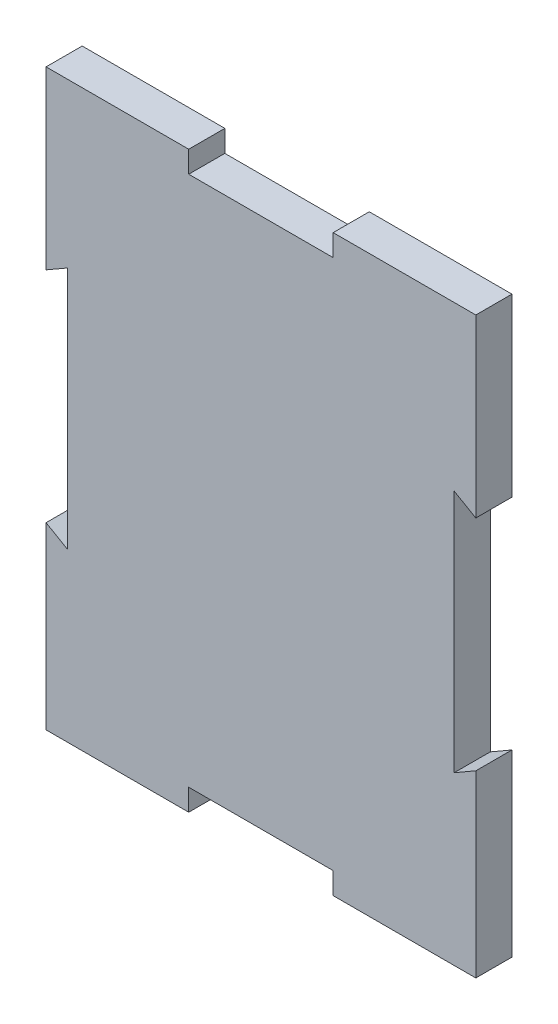
ISO-10303-21;
HEADER;
FILE_DESCRIPTION(('STEP AP214'),'2;1');
FILE_NAME('part.step','',(''),(''),'','','');
FILE_SCHEMA(('AUTOMOTIVE_DESIGN { 1 0 10303 214 1 1 1 1 }'));
ENDSEC;
DATA;
#1=APPLICATION_CONTEXT('core data for automotive mechanical design processes');
#2=APPLICATION_PROTOCOL_DEFINITION('international standard','automotive_design',2000,#1);
#3=PRODUCT_CONTEXT('',#1,'mechanical');
#4=PRODUCT('Part','Part','',(#3));
#5=PRODUCT_RELATED_PRODUCT_CATEGORY('part','',(#4));
#6=PRODUCT_DEFINITION_FORMATION('','',#4);
#7=PRODUCT_DEFINITION_CONTEXT('part definition',#1,'design');
#8=PRODUCT_DEFINITION('design','',#6,#7);
#9=PRODUCT_DEFINITION_SHAPE('','',#8);
#10=(LENGTH_UNIT() NAMED_UNIT(*) SI_UNIT(.MILLI.,.METRE.));
#11=(NAMED_UNIT(*) PLANE_ANGLE_UNIT() SI_UNIT($,.RADIAN.));
#12=(NAMED_UNIT(*) SI_UNIT($,.STERADIAN.) SOLID_ANGLE_UNIT());
#13=UNCERTAINTY_MEASURE_WITH_UNIT(LENGTH_MEASURE(1.E-05),#10,'distance_accuracy_value','');
#14=(GEOMETRIC_REPRESENTATION_CONTEXT(3) GLOBAL_UNCERTAINTY_ASSIGNED_CONTEXT((#13)) GLOBAL_UNIT_ASSIGNED_CONTEXT((#10,
#11,#12)) REPRESENTATION_CONTEXT('',''));
#15=CARTESIAN_POINT('',(0.,0.,0.));
#16=DIRECTION('',(0.,0.,1.));
#17=DIRECTION('',(1.,0.,0.));
#18=AXIS2_PLACEMENT_3D('',#15,#16,#17);
#19=CARTESIAN_POINT('',(0.,39.75,5.));
#20=DIRECTION('',(0.,-1.,0.));
#21=DIRECTION('',(1.,0.,0.));
#22=AXIS2_PLACEMENT_3D('',#19,#20,#21);
#23=PLANE('',#22);
#24=DIRECTION('',(-1.,0.,0.));
#25=VECTOR('',#24,1.);
#26=CARTESIAN_POINT('',(0.,39.75,0.));
#27=LINE('',#26,#25);
#28=CARTESIAN_POINT('',(29.75,39.75,0.));
#29=VERTEX_POINT('',#28);
#30=CARTESIAN_POINT('',(10.,39.75,0.));
#31=VERTEX_POINT('',#30);
#32=EDGE_CURVE('E211',#29,#31,#27,.T.);
#33=ORIENTED_EDGE('',*,*,#32,.T.);
#34=DIRECTION('',(0.,0.,-1.));
#35=VECTOR('',#34,1.);
#36=CARTESIAN_POINT('',(10.,39.75,5.));
#37=LINE('',#36,#35);
#38=CARTESIAN_POINT('',(10.,39.75,5.));
#39=VERTEX_POINT('',#38);
#40=EDGE_CURVE('E11',#39,#31,#37,.T.);
#41=ORIENTED_EDGE('',*,*,#40,.F.);
#42=DIRECTION('',(-1.,0.,0.));
#43=VECTOR('',#42,1.);
#44=CARTESIAN_POINT('',(0.,39.75,5.));
#45=LINE('',#44,#43);
#46=CARTESIAN_POINT('',(29.75,39.75,5.));
#47=VERTEX_POINT('',#46);
#48=EDGE_CURVE('E310',#47,#39,#45,.T.);
#49=ORIENTED_EDGE('',*,*,#48,.F.);
#50=DIRECTION('',(0.,0.,-1.));
#51=VECTOR('',#50,1.);
#52=CARTESIAN_POINT('',(29.75,39.75,5.));
#53=LINE('',#52,#51);
#54=EDGE_CURVE('E206',#47,#29,#53,.T.);
#55=ORIENTED_EDGE('',*,*,#54,.T.);
#56=EDGE_LOOP('',(#33,#41,#49,#55));
#57=FACE_BOUND('',#56,.T.);
#58=ADVANCED_FACE('F41',(#57),#23,.F.);
#59=CARTESIAN_POINT('',(10.,0.,5.));
#60=DIRECTION('',(1.,0.,0.));
#61=DIRECTION('',(0.,0.,-1.));
#62=AXIS2_PLACEMENT_3D('',#59,#60,#61);
#63=PLANE('',#62);
#64=DIRECTION('',(0.,-1.,0.));
#65=VECTOR('',#64,1.);
#66=CARTESIAN_POINT('',(10.,0.,0.));
#67=LINE('',#66,#65);
#68=CARTESIAN_POINT('',(10.,36.75,0.));
#69=VERTEX_POINT('',#68);
#70=EDGE_CURVE('E212',#31,#69,#67,.T.);
#71=ORIENTED_EDGE('',*,*,#70,.T.);
#72=DIRECTION('',(0.,0.,-1.));
#73=VECTOR('',#72,1.);
#74=CARTESIAN_POINT('',(10.,36.75,5.));
#75=LINE('',#74,#73);
#76=CARTESIAN_POINT('',(10.,36.75,5.));
#77=VERTEX_POINT('',#76);
#78=EDGE_CURVE('E49',#77,#69,#75,.T.);
#79=ORIENTED_EDGE('',*,*,#78,.F.);
#80=DIRECTION('',(0.,-1.,0.));
#81=VECTOR('',#80,1.);
#82=CARTESIAN_POINT('',(10.,0.,5.));
#83=LINE('',#82,#81);
#84=EDGE_CURVE('E140',#39,#77,#83,.T.);
#85=ORIENTED_EDGE('',*,*,#84,.F.);
#86=ORIENTED_EDGE('',*,*,#40,.T.);
#87=EDGE_LOOP('',(#71,#79,#85,#86));
#88=FACE_BOUND('',#87,.T.);
#89=ADVANCED_FACE('F43',(#88),#63,.F.);
#90=CARTESIAN_POINT('',(0.,36.75,5.));
#91=DIRECTION('',(0.,-1.,0.));
#92=DIRECTION('',(0.,0.,-1.));
#93=AXIS2_PLACEMENT_3D('',#90,#91,#92);
#94=PLANE('',#93);
#95=DIRECTION('',(-1.,0.,0.));
#96=VECTOR('',#95,1.);
#97=CARTESIAN_POINT('',(0.,36.75,0.));
#98=LINE('',#97,#96);
#99=CARTESIAN_POINT('',(-9.99999999999999,36.75,0.));
#100=VERTEX_POINT('',#99);
#101=EDGE_CURVE('E220',#69,#100,#98,.T.);
#102=ORIENTED_EDGE('',*,*,#101,.T.);
#103=DIRECTION('',(0.,0.,-1.));
#104=VECTOR('',#103,1.);
#105=CARTESIAN_POINT('',(-9.99999999999999,36.75,5.));
#106=LINE('',#105,#104);
#107=CARTESIAN_POINT('',(-9.99999999999999,36.75,5.));
#108=VERTEX_POINT('',#107);
#109=EDGE_CURVE('E284',#108,#100,#106,.T.);
#110=ORIENTED_EDGE('',*,*,#109,.F.);
#111=DIRECTION('',(-1.,0.,0.));
#112=VECTOR('',#111,1.);
#113=CARTESIAN_POINT('',(0.,36.75,5.));
#114=LINE('',#113,#112);
#115=EDGE_CURVE('E295',#77,#108,#114,.T.);
#116=ORIENTED_EDGE('',*,*,#115,.F.);
#117=ORIENTED_EDGE('',*,*,#78,.T.);
#118=EDGE_LOOP('',(#102,#110,#116,#117));
#119=FACE_BOUND('',#118,.T.);
#120=ADVANCED_FACE('F287',(#119),#94,.F.);
#121=CARTESIAN_POINT('',(-9.99999999999999,0.,5.));
#122=DIRECTION('',(1.,0.,0.));
#123=DIRECTION('',(0.,0.,-1.));
#124=AXIS2_PLACEMENT_3D('',#121,#122,#123);
#125=PLANE('',#124);
#126=DIRECTION('',(0.,-1.,0.));
#127=VECTOR('',#126,1.);
#128=CARTESIAN_POINT('',(-9.99999999999999,0.,0.));
#129=LINE('',#128,#127);
#130=CARTESIAN_POINT('',(-9.99999999999999,39.75,0.));
#131=VERTEX_POINT('',#130);
#132=EDGE_CURVE('E219',#131,#100,#129,.T.);
#133=ORIENTED_EDGE('',*,*,#132,.F.);
#134=DIRECTION('',(0.,0.,-1.));
#135=VECTOR('',#134,1.);
#136=CARTESIAN_POINT('',(-9.99999999999999,39.75,5.));
#137=LINE('',#136,#135);
#138=CARTESIAN_POINT('',(-9.99999999999999,39.75,5.));
#139=VERTEX_POINT('',#138);
#140=EDGE_CURVE('E282',#139,#131,#137,.T.);
#141=ORIENTED_EDGE('',*,*,#140,.F.);
#142=DIRECTION('',(0.,-1.,0.));
#143=VECTOR('',#142,1.);
#144=CARTESIAN_POINT('',(-9.99999999999999,0.,5.));
#145=LINE('',#144,#143);
#146=EDGE_CURVE('E304',#139,#108,#145,.T.);
#147=ORIENTED_EDGE('',*,*,#146,.T.);
#148=ORIENTED_EDGE('',*,*,#109,.T.);
#149=EDGE_LOOP('',(#133,#141,#147,#148));
#150=FACE_BOUND('',#149,.T.);
#151=ADVANCED_FACE('F299',(#150),#125,.T.);
#152=CARTESIAN_POINT('',(-29.75,39.75,0.));
#153=VERTEX_POINT('',#152);
#154=EDGE_CURVE('E214',#131,#153,#27,.T.);
#155=ORIENTED_EDGE('',*,*,#154,.T.);
#156=DIRECTION('',(0.,0.,-1.));
#157=VECTOR('',#156,1.);
#158=CARTESIAN_POINT('',(-29.75,39.75,5.));
#159=LINE('',#158,#157);
#160=CARTESIAN_POINT('',(-29.75,39.75,5.));
#161=VERTEX_POINT('',#160);
#162=EDGE_CURVE('E281',#161,#153,#159,.T.);
#163=ORIENTED_EDGE('',*,*,#162,.F.);
#164=EDGE_CURVE('E302',#139,#161,#45,.T.);
#165=ORIENTED_EDGE('',*,*,#164,.F.);
#166=ORIENTED_EDGE('',*,*,#140,.T.);
#167=EDGE_LOOP('',(#155,#163,#165,#166));
#168=FACE_BOUND('',#167,.T.);
#169=ADVANCED_FACE('F364',(#168),#23,.F.);
#170=CARTESIAN_POINT('',(-29.75,0.,5.));
#171=DIRECTION('',(-1.,0.,0.));
#172=DIRECTION('',(0.,-1.,0.));
#173=AXIS2_PLACEMENT_3D('',#170,#171,#172);
#174=PLANE('',#173);
#175=DIRECTION('',(0.,1.,0.));
#176=VECTOR('',#175,1.);
#177=CARTESIAN_POINT('',(-29.75,0.,0.));
#178=LINE('',#177,#176);
#179=CARTESIAN_POINT('',(-29.75,15.4054445662277,0.));
#180=VERTEX_POINT('',#179);
#181=EDGE_CURVE('E224',#180,#153,#178,.T.);
#182=ORIENTED_EDGE('',*,*,#181,.F.);
#183=DIRECTION('',(0.,0.,-1.));
#184=VECTOR('',#183,1.);
#185=CARTESIAN_POINT('',(-29.75,15.4054445662277,5.));
#186=LINE('',#185,#184);
#187=CARTESIAN_POINT('',(-29.75,15.4054445662277,5.));
#188=VERTEX_POINT('',#187);
#189=EDGE_CURVE('E276',#188,#180,#186,.T.);
#190=ORIENTED_EDGE('',*,*,#189,.F.);
#191=DIRECTION('',(0.,1.,0.));
#192=VECTOR('',#191,1.);
#193=CARTESIAN_POINT('',(-29.75,0.,5.));
#194=LINE('',#193,#192);
#195=EDGE_CURVE('E307',#188,#161,#194,.T.);
#196=ORIENTED_EDGE('',*,*,#195,.T.);
#197=ORIENTED_EDGE('',*,*,#162,.T.);
#198=EDGE_LOOP('',(#182,#190,#196,#197));
#199=FACE_BOUND('',#198,.T.);
#200=ADVANCED_FACE('F371',(#199),#174,.T.);
#201=CARTESIAN_POINT('',(-14.1082531754731,24.4362113059643,5.));
#202=DIRECTION('',(0.5,-0.866025403784438,0.));
#203=DIRECTION('',(0.866025403784438,0.5,0.));
#204=AXIS2_PLACEMENT_3D('',#201,#202,#203);
#205=PLANE('',#204);
#206=DIRECTION('',(-0.866025403784439,-0.5,0.));
#207=VECTOR('',#206,1.);
#208=CARTESIAN_POINT('',(-14.1082531754731,24.4362113059643,0.));
#209=LINE('',#208,#207);
#210=CARTESIAN_POINT('',(-26.75,17.1374953737966,0.));
#211=VERTEX_POINT('',#210);
#212=EDGE_CURVE('E226',#211,#180,#209,.T.);
#213=ORIENTED_EDGE('',*,*,#212,.F.);
#214=DIRECTION('',(0.,0.,-1.));
#215=VECTOR('',#214,1.);
#216=CARTESIAN_POINT('',(-26.75,17.1374953737966,5.));
#217=LINE('',#216,#215);
#218=CARTESIAN_POINT('',(-26.75,17.1374953737966,5.));
#219=VERTEX_POINT('',#218);
#220=EDGE_CURVE('E280',#219,#211,#217,.T.);
#221=ORIENTED_EDGE('',*,*,#220,.F.);
#222=DIRECTION('',(-0.866025403784439,-0.5,0.));
#223=VECTOR('',#222,1.);
#224=CARTESIAN_POINT('',(-14.1082531754731,24.4362113059643,5.));
#225=LINE('',#224,#223);
#226=EDGE_CURVE('E312',#219,#188,#225,.T.);
#227=ORIENTED_EDGE('',*,*,#226,.T.);
#228=ORIENTED_EDGE('',*,*,#189,.T.);
#229=EDGE_LOOP('',(#213,#221,#227,#228));
#230=FACE_BOUND('',#229,.T.);
#231=ADVANCED_FACE('F380',(#230),#205,.T.);
#232=CARTESIAN_POINT('',(-26.75,0.,5.));
#233=DIRECTION('',(-1.,0.,0.));
#234=DIRECTION('',(0.,0.,1.));
#235=AXIS2_PLACEMENT_3D('',#232,#233,#234);
#236=PLANE('',#235);
#237=DIRECTION('',(0.,1.,0.));
#238=VECTOR('',#237,1.);
#239=CARTESIAN_POINT('',(-26.75,0.,0.));
#240=LINE('',#239,#238);
#241=CARTESIAN_POINT('',(-26.75,-16.6374953737965,0.));
#242=VERTEX_POINT('',#241);
#243=EDGE_CURVE('E229',#242,#211,#240,.T.);
#244=ORIENTED_EDGE('',*,*,#243,.F.);
#245=DIRECTION('',(0.,0.,-1.));
#246=VECTOR('',#245,1.);
#247=CARTESIAN_POINT('',(-26.75,-16.6374953737965,5.));
#248=LINE('',#247,#246);
#249=CARTESIAN_POINT('',(-26.75,-16.6374953737965,5.));
#250=VERTEX_POINT('',#249);
#251=EDGE_CURVE('E274',#250,#242,#248,.T.);
#252=ORIENTED_EDGE('',*,*,#251,.F.);
#253=DIRECTION('',(0.,1.,0.));
#254=VECTOR('',#253,1.);
#255=CARTESIAN_POINT('',(-26.75,0.,5.));
#256=LINE('',#255,#254);
#257=EDGE_CURVE('E317',#250,#219,#256,.T.);
#258=ORIENTED_EDGE('',*,*,#257,.T.);
#259=ORIENTED_EDGE('',*,*,#220,.T.);
#260=EDGE_LOOP('',(#244,#252,#258,#259));
#261=FACE_BOUND('',#260,.T.);
#262=ADVANCED_FACE('F388',(#261),#236,.T.);
#263=CARTESIAN_POINT('',(-13.8917468245269,-24.0612113059643,5.));
#264=DIRECTION('',(0.5,0.866025403784439,0.));
#265=DIRECTION('',(-0.866025403784439,0.5,0.));
#266=AXIS2_PLACEMENT_3D('',#263,#264,#265);
#267=PLANE('',#266);
#268=DIRECTION('',(0.866025403784439,-0.5,0.));
#269=VECTOR('',#268,1.);
#270=CARTESIAN_POINT('',(-13.8917468245269,-24.0612113059643,0.));
#271=LINE('',#270,#269);
#272=CARTESIAN_POINT('',(-29.75,-14.9054445662276,0.));
#273=VERTEX_POINT('',#272);
#274=EDGE_CURVE('E231',#273,#242,#271,.T.);
#275=ORIENTED_EDGE('',*,*,#274,.F.);
#276=DIRECTION('',(0.,0.,-1.));
#277=VECTOR('',#276,1.);
#278=CARTESIAN_POINT('',(-29.75,-14.9054445662276,5.));
#279=LINE('',#278,#277);
#280=CARTESIAN_POINT('',(-29.75,-14.9054445662276,5.));
#281=VERTEX_POINT('',#280);
#282=EDGE_CURVE('E272',#281,#273,#279,.T.);
#283=ORIENTED_EDGE('',*,*,#282,.F.);
#284=DIRECTION('',(0.866025403784439,-0.5,0.));
#285=VECTOR('',#284,1.);
#286=CARTESIAN_POINT('',(-13.8917468245269,-24.0612113059643,5.));
#287=LINE('',#286,#285);
#288=EDGE_CURVE('E325',#281,#250,#287,.T.);
#289=ORIENTED_EDGE('',*,*,#288,.T.);
#290=ORIENTED_EDGE('',*,*,#251,.T.);
#291=EDGE_LOOP('',(#275,#283,#289,#290));
#292=FACE_BOUND('',#291,.T.);
#293=ADVANCED_FACE('F398',(#292),#267,.T.);
#294=CARTESIAN_POINT('',(-29.75,-39.75,0.));
#295=VERTEX_POINT('',#294);
#296=EDGE_CURVE('E230',#295,#273,#178,.T.);
#297=ORIENTED_EDGE('',*,*,#296,.F.);
#298=DIRECTION('',(0.,0.,-1.));
#299=VECTOR('',#298,1.);
#300=CARTESIAN_POINT('',(-29.75,-39.75,5.));
#301=LINE('',#300,#299);
#302=CARTESIAN_POINT('',(-29.75,-39.75,5.));
#303=VERTEX_POINT('',#302);
#304=EDGE_CURVE('E271',#303,#295,#301,.T.);
#305=ORIENTED_EDGE('',*,*,#304,.F.);
#306=EDGE_CURVE('E316',#303,#281,#194,.T.);
#307=ORIENTED_EDGE('',*,*,#306,.T.);
#308=ORIENTED_EDGE('',*,*,#282,.T.);
#309=EDGE_LOOP('',(#297,#305,#307,#308));
#310=FACE_BOUND('',#309,.T.);
#311=ADVANCED_FACE('F379',(#310),#174,.T.);
#312=CARTESIAN_POINT('',(0.,-39.75,5.));
#313=DIRECTION('',(0.,-1.,0.));
#314=DIRECTION('',(1.,0.,0.));
#315=AXIS2_PLACEMENT_3D('',#312,#313,#314);
#316=PLANE('',#315);
#317=DIRECTION('',(-1.,0.,0.));
#318=VECTOR('',#317,1.);
#319=CARTESIAN_POINT('',(0.,-39.75,0.));
#320=LINE('',#319,#318);
#321=CARTESIAN_POINT('',(-9.99999999999999,-39.75,0.));
#322=VERTEX_POINT('',#321);
#323=EDGE_CURVE('E237',#322,#295,#320,.T.);
#324=ORIENTED_EDGE('',*,*,#323,.F.);
#325=DIRECTION('',(0.,0.,-1.));
#326=VECTOR('',#325,1.);
#327=CARTESIAN_POINT('',(-9.99999999999999,-39.75,5.));
#328=LINE('',#327,#326);
#329=CARTESIAN_POINT('',(-9.99999999999999,-39.75,5.));
#330=VERTEX_POINT('',#329);
#331=EDGE_CURVE('E267',#330,#322,#328,.T.);
#332=ORIENTED_EDGE('',*,*,#331,.F.);
#333=DIRECTION('',(-1.,0.,0.));
#334=VECTOR('',#333,1.);
#335=CARTESIAN_POINT('',(0.,-39.75,5.));
#336=LINE('',#335,#334);
#337=EDGE_CURVE('E324',#330,#303,#336,.T.);
#338=ORIENTED_EDGE('',*,*,#337,.T.);
#339=ORIENTED_EDGE('',*,*,#304,.T.);
#340=EDGE_LOOP('',(#324,#332,#338,#339));
#341=FACE_BOUND('',#340,.T.);
#342=ADVANCED_FACE('F401',(#341),#316,.T.);
#343=CARTESIAN_POINT('',(-9.99999999999999,0.,5.));
#344=DIRECTION('',(-1.,0.,0.));
#345=DIRECTION('',(0.,0.,1.));
#346=AXIS2_PLACEMENT_3D('',#343,#344,#345);
#347=PLANE('',#346);
#348=DIRECTION('',(0.,1.,0.));
#349=VECTOR('',#348,1.);
#350=CARTESIAN_POINT('',(-9.99999999999999,0.,0.));
#351=LINE('',#350,#349);
#352=CARTESIAN_POINT('',(-9.99999999999999,-36.75,0.));
#353=VERTEX_POINT('',#352);
#354=EDGE_CURVE('E239',#322,#353,#351,.T.);
#355=ORIENTED_EDGE('',*,*,#354,.T.);
#356=DIRECTION('',(0.,0.,-1.));
#357=VECTOR('',#356,1.);
#358=CARTESIAN_POINT('',(-9.99999999999999,-36.75,5.));
#359=LINE('',#358,#357);
#360=CARTESIAN_POINT('',(-9.99999999999999,-36.75,5.));
#361=VERTEX_POINT('',#360);
#362=EDGE_CURVE('E270',#361,#353,#359,.T.);
#363=ORIENTED_EDGE('',*,*,#362,.F.);
#364=DIRECTION('',(0.,1.,0.));
#365=VECTOR('',#364,1.);
#366=CARTESIAN_POINT('',(-9.99999999999999,0.,5.));
#367=LINE('',#366,#365);
#368=EDGE_CURVE('E327',#330,#361,#367,.T.);
#369=ORIENTED_EDGE('',*,*,#368,.F.);
#370=ORIENTED_EDGE('',*,*,#331,.T.);
#371=EDGE_LOOP('',(#355,#363,#369,#370));
#372=FACE_BOUND('',#371,.T.);
#373=ADVANCED_FACE('F407',(#372),#347,.F.);
#374=CARTESIAN_POINT('',(0.,-36.75,5.));
#375=DIRECTION('',(0.,-1.,0.));
#376=DIRECTION('',(0.,0.,-1.));
#377=AXIS2_PLACEMENT_3D('',#374,#375,#376);
#378=PLANE('',#377);
#379=DIRECTION('',(-1.,0.,0.));
#380=VECTOR('',#379,1.);
#381=CARTESIAN_POINT('',(0.,-36.75,0.));
#382=LINE('',#381,#380);
#383=CARTESIAN_POINT('',(10.,-36.75,0.));
#384=VERTEX_POINT('',#383);
#385=EDGE_CURVE('E242',#384,#353,#382,.T.);
#386=ORIENTED_EDGE('',*,*,#385,.F.);
#387=DIRECTION('',(0.,0.,-1.));
#388=VECTOR('',#387,1.);
#389=CARTESIAN_POINT('',(10.,-36.75,5.));
#390=LINE('',#389,#388);
#391=CARTESIAN_POINT('',(10.,-36.75,5.));
#392=VERTEX_POINT('',#391);
#393=EDGE_CURVE('E264',#392,#384,#390,.T.);
#394=ORIENTED_EDGE('',*,*,#393,.F.);
#395=DIRECTION('',(-1.,0.,0.));
#396=VECTOR('',#395,1.);
#397=CARTESIAN_POINT('',(0.,-36.75,5.));
#398=LINE('',#397,#396);
#399=EDGE_CURVE('E332',#392,#361,#398,.T.);
#400=ORIENTED_EDGE('',*,*,#399,.T.);
#401=ORIENTED_EDGE('',*,*,#362,.T.);
#402=EDGE_LOOP('',(#386,#394,#400,#401));
#403=FACE_BOUND('',#402,.T.);
#404=ADVANCED_FACE('F409',(#403),#378,.T.);
#405=CARTESIAN_POINT('',(10.,0.,5.));
#406=DIRECTION('',(-1.,0.,0.));
#407=DIRECTION('',(0.,0.,1.));
#408=AXIS2_PLACEMENT_3D('',#405,#406,#407);
#409=PLANE('',#408);
#410=DIRECTION('',(0.,1.,0.));
#411=VECTOR('',#410,1.);
#412=CARTESIAN_POINT('',(10.,0.,0.));
#413=LINE('',#412,#411);
#414=CARTESIAN_POINT('',(10.,-39.75,0.));
#415=VERTEX_POINT('',#414);
#416=EDGE_CURVE('E248',#415,#384,#413,.T.);
#417=ORIENTED_EDGE('',*,*,#416,.F.);
#418=DIRECTION('',(0.,0.,-1.));
#419=VECTOR('',#418,1.);
#420=CARTESIAN_POINT('',(10.,-39.75,5.));
#421=LINE('',#420,#419);
#422=CARTESIAN_POINT('',(10.,-39.75,5.));
#423=VERTEX_POINT('',#422);
#424=EDGE_CURVE('E263',#423,#415,#421,.T.);
#425=ORIENTED_EDGE('',*,*,#424,.F.);
#426=DIRECTION('',(0.,1.,0.));
#427=VECTOR('',#426,1.);
#428=CARTESIAN_POINT('',(10.,0.,5.));
#429=LINE('',#428,#427);
#430=EDGE_CURVE('E331',#423,#392,#429,.T.);
#431=ORIENTED_EDGE('',*,*,#430,.T.);
#432=ORIENTED_EDGE('',*,*,#393,.T.);
#433=EDGE_LOOP('',(#417,#425,#431,#432));
#434=FACE_BOUND('',#433,.T.);
#435=ADVANCED_FACE('F350',(#434),#409,.T.);
#436=CARTESIAN_POINT('',(29.75,-39.75,0.));
#437=VERTEX_POINT('',#436);
#438=EDGE_CURVE('E238',#437,#415,#320,.T.);
#439=ORIENTED_EDGE('',*,*,#438,.F.);
#440=DIRECTION('',(0.,0.,-1.));
#441=VECTOR('',#440,1.);
#442=CARTESIAN_POINT('',(29.75,-39.75,5.));
#443=LINE('',#442,#441);
#444=CARTESIAN_POINT('',(29.75,-39.75,5.));
#445=VERTEX_POINT('',#444);
#446=EDGE_CURVE('E261',#445,#437,#443,.T.);
#447=ORIENTED_EDGE('',*,*,#446,.F.);
#448=EDGE_CURVE('E328',#445,#423,#336,.T.);
#449=ORIENTED_EDGE('',*,*,#448,.T.);
#450=ORIENTED_EDGE('',*,*,#424,.T.);
#451=EDGE_LOOP('',(#439,#447,#449,#450));
#452=FACE_BOUND('',#451,.T.);
#453=ADVANCED_FACE('F345',(#452),#316,.T.);
#454=CARTESIAN_POINT('',(29.75,0.,5.));
#455=DIRECTION('',(-1.,0.,0.));
#456=DIRECTION('',(0.,0.,1.));
#457=AXIS2_PLACEMENT_3D('',#454,#455,#456);
#458=PLANE('',#457);
#459=DIRECTION('',(0.,1.,0.));
#460=VECTOR('',#459,1.);
#461=CARTESIAN_POINT('',(29.75,0.,0.));
#462=LINE('',#461,#460);
#463=CARTESIAN_POINT('',(29.75,-14.9054445662277,0.));
#464=VERTEX_POINT('',#463);
#465=EDGE_CURVE('E249',#437,#464,#462,.T.);
#466=ORIENTED_EDGE('',*,*,#465,.T.);
#467=DIRECTION('',(0.,0.,-1.));
#468=VECTOR('',#467,1.);
#469=CARTESIAN_POINT('',(29.75,-14.9054445662277,5.));
#470=LINE('',#469,#468);
#471=CARTESIAN_POINT('',(29.75,-14.9054445662277,5.));
#472=VERTEX_POINT('',#471);
#473=EDGE_CURVE('E256',#472,#464,#470,.T.);
#474=ORIENTED_EDGE('',*,*,#473,.F.);
#475=DIRECTION('',(0.,1.,0.));
#476=VECTOR('',#475,1.);
#477=CARTESIAN_POINT('',(29.75,0.,5.));
#478=LINE('',#477,#476);
#479=EDGE_CURVE('E208',#445,#472,#478,.T.);
#480=ORIENTED_EDGE('',*,*,#479,.F.);
#481=ORIENTED_EDGE('',*,*,#446,.T.);
#482=EDGE_LOOP('',(#466,#474,#480,#481));
#483=FACE_BOUND('',#482,.T.);
#484=ADVANCED_FACE('F352',(#483),#458,.F.);
#485=CARTESIAN_POINT('',(13.8917468245269,-24.0612113059643,5.));
#486=DIRECTION('',(0.5,-0.866025403784439,0.));
#487=DIRECTION('',(0.866025403784439,0.5,0.));
#488=AXIS2_PLACEMENT_3D('',#485,#486,#487);
#489=PLANE('',#488);
#490=DIRECTION('',(-0.866025403784439,-0.5,0.));
#491=VECTOR('',#490,1.);
#492=CARTESIAN_POINT('',(13.8917468245269,-24.0612113059643,0.));
#493=LINE('',#492,#491);
#494=CARTESIAN_POINT('',(26.75,-16.6374953737965,0.));
#495=VERTEX_POINT('',#494);
#496=EDGE_CURVE('E253',#464,#495,#493,.T.);
#497=ORIENTED_EDGE('',*,*,#496,.T.);
#498=DIRECTION('',(0.,0.,-1.));
#499=VECTOR('',#498,1.);
#500=CARTESIAN_POINT('',(26.75,-16.6374953737965,5.));
#501=LINE('',#500,#499);
#502=CARTESIAN_POINT('',(26.75,-16.6374953737965,5.));
#503=VERTEX_POINT('',#502);
#504=EDGE_CURVE('E203',#503,#495,#501,.T.);
#505=ORIENTED_EDGE('',*,*,#504,.F.);
#506=DIRECTION('',(-0.866025403784439,-0.5,0.));
#507=VECTOR('',#506,1.);
#508=CARTESIAN_POINT('',(13.8917468245269,-24.0612113059643,5.));
#509=LINE('',#508,#507);
#510=EDGE_CURVE('E195',#472,#503,#509,.T.);
#511=ORIENTED_EDGE('',*,*,#510,.F.);
#512=ORIENTED_EDGE('',*,*,#473,.T.);
#513=EDGE_LOOP('',(#497,#505,#511,#512));
#514=FACE_BOUND('',#513,.T.);
#515=ADVANCED_FACE('F354',(#514),#489,.F.);
#516=CARTESIAN_POINT('',(26.75,0.,5.));
#517=DIRECTION('',(-1.,0.,0.));
#518=DIRECTION('',(0.,0.,1.));
#519=AXIS2_PLACEMENT_3D('',#516,#517,#518);
#520=PLANE('',#519);
#521=DIRECTION('',(0.,1.,0.));
#522=VECTOR('',#521,1.);
#523=CARTESIAN_POINT('',(26.75,0.,0.));
#524=LINE('',#523,#522);
#525=CARTESIAN_POINT('',(26.75,17.1374953737966,0.));
#526=VERTEX_POINT('',#525);
#527=EDGE_CURVE('E199',#495,#526,#524,.T.);
#528=ORIENTED_EDGE('',*,*,#527,.T.);
#529=DIRECTION('',(0.,0.,-1.));
#530=VECTOR('',#529,1.);
#531=CARTESIAN_POINT('',(26.75,17.1374953737966,5.));
#532=LINE('',#531,#530);
#533=CARTESIAN_POINT('',(26.75,17.1374953737966,5.));
#534=VERTEX_POINT('',#533);
#535=EDGE_CURVE('E197',#534,#526,#532,.T.);
#536=ORIENTED_EDGE('',*,*,#535,.F.);
#537=DIRECTION('',(0.,1.,0.));
#538=VECTOR('',#537,1.);
#539=CARTESIAN_POINT('',(26.75,0.,5.));
#540=LINE('',#539,#538);
#541=EDGE_CURVE('E186',#503,#534,#540,.T.);
#542=ORIENTED_EDGE('',*,*,#541,.F.);
#543=ORIENTED_EDGE('',*,*,#504,.T.);
#544=EDGE_LOOP('',(#528,#536,#542,#543));
#545=FACE_BOUND('',#544,.T.);
#546=ADVANCED_FACE('F196',(#545),#520,.F.);
#547=CARTESIAN_POINT('',(14.1082531754731,24.4362113059643,5.));
#548=DIRECTION('',(0.5,0.866025403784438,0.));
#549=DIRECTION('',(-0.866025403784438,0.5,0.));
#550=AXIS2_PLACEMENT_3D('',#547,#548,#549);
#551=PLANE('',#550);
#552=DIRECTION('',(0.866025403784439,-0.5,0.));
#553=VECTOR('',#552,1.);
#554=CARTESIAN_POINT('',(14.1082531754731,24.4362113059643,0.));
#555=LINE('',#554,#553);
#556=CARTESIAN_POINT('',(29.75,15.4054445662277,0.));
#557=VERTEX_POINT('',#556);
#558=EDGE_CURVE('E121',#526,#557,#555,.T.);
#559=ORIENTED_EDGE('',*,*,#558,.T.);
#560=DIRECTION('',(0.,0.,-1.));
#561=VECTOR('',#560,1.);
#562=CARTESIAN_POINT('',(29.75,15.4054445662277,5.));
#563=LINE('',#562,#561);
#564=CARTESIAN_POINT('',(29.75,15.4054445662277,5.));
#565=VERTEX_POINT('',#564);
#566=EDGE_CURVE('E205',#565,#557,#563,.T.);
#567=ORIENTED_EDGE('',*,*,#566,.F.);
#568=DIRECTION('',(0.866025403784439,-0.5,0.));
#569=VECTOR('',#568,1.);
#570=CARTESIAN_POINT('',(14.1082531754731,24.4362113059643,5.));
#571=LINE('',#570,#569);
#572=EDGE_CURVE('E189',#534,#565,#571,.T.);
#573=ORIENTED_EDGE('',*,*,#572,.F.);
#574=ORIENTED_EDGE('',*,*,#535,.T.);
#575=EDGE_LOOP('',(#559,#567,#573,#574));
#576=FACE_BOUND('',#575,.T.);
#577=ADVANCED_FACE('F204',(#576),#551,.F.);
#578=EDGE_CURVE('E129',#557,#29,#462,.T.);
#579=ORIENTED_EDGE('',*,*,#578,.T.);
#580=ORIENTED_EDGE('',*,*,#54,.F.);
#581=EDGE_CURVE('E59',#565,#47,#478,.T.);
#582=ORIENTED_EDGE('',*,*,#581,.F.);
#583=ORIENTED_EDGE('',*,*,#566,.T.);
#584=EDGE_LOOP('',(#579,#580,#582,#583));
#585=FACE_BOUND('',#584,.T.);
#586=ADVANCED_FACE('F482',(#585),#458,.F.);
#587=CARTESIAN_POINT('',(0.,0.,5.));
#588=DIRECTION('',(0.,0.,1.));
#589=DIRECTION('',(1.,0.,0.));
#590=AXIS2_PLACEMENT_3D('',#587,#588,#589);
#591=PLANE('',#590);
#592=ORIENTED_EDGE('',*,*,#48,.T.);
#593=ORIENTED_EDGE('',*,*,#84,.T.);
#594=ORIENTED_EDGE('',*,*,#115,.T.);
#595=ORIENTED_EDGE('',*,*,#146,.F.);
#596=ORIENTED_EDGE('',*,*,#164,.T.);
#597=ORIENTED_EDGE('',*,*,#195,.F.);
#598=ORIENTED_EDGE('',*,*,#226,.F.);
#599=ORIENTED_EDGE('',*,*,#257,.F.);
#600=ORIENTED_EDGE('',*,*,#288,.F.);
#601=ORIENTED_EDGE('',*,*,#306,.F.);
#602=ORIENTED_EDGE('',*,*,#337,.F.);
#603=ORIENTED_EDGE('',*,*,#368,.T.);
#604=ORIENTED_EDGE('',*,*,#399,.F.);
#605=ORIENTED_EDGE('',*,*,#430,.F.);
#606=ORIENTED_EDGE('',*,*,#448,.F.);
#607=ORIENTED_EDGE('',*,*,#479,.T.);
#608=ORIENTED_EDGE('',*,*,#510,.T.);
#609=ORIENTED_EDGE('',*,*,#541,.T.);
#610=ORIENTED_EDGE('',*,*,#572,.T.);
#611=ORIENTED_EDGE('',*,*,#581,.T.);
#612=EDGE_LOOP('',(#592,#593,#594,#595,#596,#597,#598,#599,#600,#601,#602,#603,#604,#605,#606,
#607,#608,#609,#610,#611));
#613=FACE_BOUND('',#612,.T.);
#614=ADVANCED_FACE('F187',(#613),#591,.T.);
#615=CARTESIAN_POINT('',(0.,0.,0.));
#616=DIRECTION('',(0.,0.,1.));
#617=DIRECTION('',(1.,0.,0.));
#618=AXIS2_PLACEMENT_3D('',#615,#616,#617);
#619=PLANE('',#618);
#620=ORIENTED_EDGE('',*,*,#32,.F.);
#621=ORIENTED_EDGE('',*,*,#578,.F.);
#622=ORIENTED_EDGE('',*,*,#558,.F.);
#623=ORIENTED_EDGE('',*,*,#527,.F.);
#624=ORIENTED_EDGE('',*,*,#496,.F.);
#625=ORIENTED_EDGE('',*,*,#465,.F.);
#626=ORIENTED_EDGE('',*,*,#438,.T.);
#627=ORIENTED_EDGE('',*,*,#416,.T.);
#628=ORIENTED_EDGE('',*,*,#385,.T.);
#629=ORIENTED_EDGE('',*,*,#354,.F.);
#630=ORIENTED_EDGE('',*,*,#323,.T.);
#631=ORIENTED_EDGE('',*,*,#296,.T.);
#632=ORIENTED_EDGE('',*,*,#274,.T.);
#633=ORIENTED_EDGE('',*,*,#243,.T.);
#634=ORIENTED_EDGE('',*,*,#212,.T.);
#635=ORIENTED_EDGE('',*,*,#181,.T.);
#636=ORIENTED_EDGE('',*,*,#154,.F.);
#637=ORIENTED_EDGE('',*,*,#132,.T.);
#638=ORIENTED_EDGE('',*,*,#101,.F.);
#639=ORIENTED_EDGE('',*,*,#70,.F.);
#640=EDGE_LOOP('',(#620,#621,#622,#623,#624,#625,#626,#627,#628,#629,#630,#631,#632,#633,#634,
#635,#636,#637,#638,#639));
#641=FACE_BOUND('',#640,.T.);
#642=ADVANCED_FACE('F293',(#641),#619,.F.);
#643=CLOSED_SHELL('',(#58,#89,#120,#151,#169,#200,#231,#262,#293,#311,#342,#373,#404,#435,#453,
#484,#515,#546,#577,#586,#614,#642));
#644=MANIFOLD_SOLID_BREP('B2',#643);
#645=ADVANCED_BREP_SHAPE_REPRESENTATION('',(#18,#644),#14);
#646=SHAPE_DEFINITION_REPRESENTATION(#9,#645);
ENDSEC;
END-ISO-10303-21;
